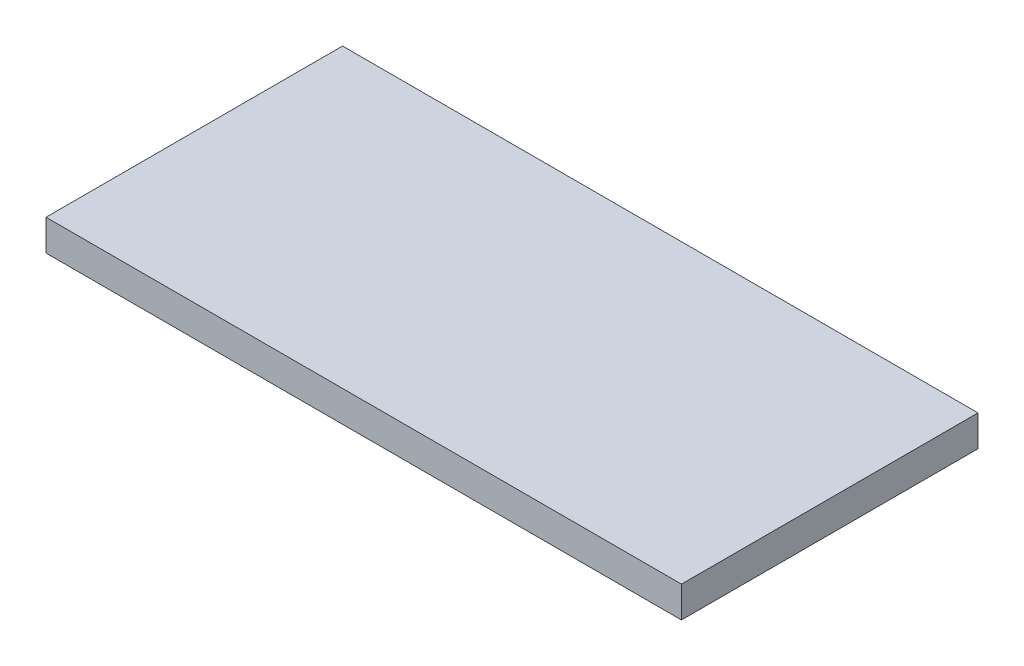
ISO-10303-21;
HEADER;
FILE_DESCRIPTION(('STEP AP214'),'2;1');
FILE_NAME('part.step','',(''),(''),'','','');
FILE_SCHEMA(('AUTOMOTIVE_DESIGN { 1 0 10303 214 1 1 1 1 }'));
ENDSEC;
DATA;
#1=APPLICATION_CONTEXT('core data for automotive mechanical design processes');
#2=APPLICATION_PROTOCOL_DEFINITION('international standard','automotive_design',2000,#1);
#3=PRODUCT_CONTEXT('',#1,'mechanical');
#4=PRODUCT('Part','Part','',(#3));
#5=PRODUCT_RELATED_PRODUCT_CATEGORY('part','',(#4));
#6=PRODUCT_DEFINITION_FORMATION('','',#4);
#7=PRODUCT_DEFINITION_CONTEXT('part definition',#1,'design');
#8=PRODUCT_DEFINITION('design','',#6,#7);
#9=PRODUCT_DEFINITION_SHAPE('','',#8);
#10=(LENGTH_UNIT() NAMED_UNIT(*) SI_UNIT(.MILLI.,.METRE.));
#11=(NAMED_UNIT(*) PLANE_ANGLE_UNIT() SI_UNIT($,.RADIAN.));
#12=(NAMED_UNIT(*) SI_UNIT($,.STERADIAN.) SOLID_ANGLE_UNIT());
#13=UNCERTAINTY_MEASURE_WITH_UNIT(LENGTH_MEASURE(1.E-05),#10,'distance_accuracy_value','');
#14=(GEOMETRIC_REPRESENTATION_CONTEXT(3) GLOBAL_UNCERTAINTY_ASSIGNED_CONTEXT((#13)) GLOBAL_UNIT_ASSIGNED_CONTEXT((#10,
#11,#12)) REPRESENTATION_CONTEXT('',''));
#15=CARTESIAN_POINT('',(0.,0.,0.));
#16=DIRECTION('',(0.,0.,1.));
#17=DIRECTION('',(1.,0.,0.));
#18=AXIS2_PLACEMENT_3D('',#15,#16,#17);
#19=CARTESIAN_POINT('',(22.5,2.2,10.5));
#20=DIRECTION('',(-1.,0.,0.));
#21=DIRECTION('',(0.,0.,1.));
#22=AXIS2_PLACEMENT_3D('',#19,#20,#21);
#23=PLANE('',#22);
#24=DIRECTION('',(0.,0.,-1.));
#25=VECTOR('',#24,1.);
#26=CARTESIAN_POINT('',(22.5,0.,10.5));
#27=LINE('',#26,#25);
#28=CARTESIAN_POINT('',(22.5,0.,10.5));
#29=VERTEX_POINT('',#28);
#30=CARTESIAN_POINT('',(22.5,0.,-10.5));
#31=VERTEX_POINT('',#30);
#32=EDGE_CURVE('E104',#29,#31,#27,.T.);
#33=ORIENTED_EDGE('',*,*,#32,.T.);
#34=DIRECTION('',(0.,-1.,0.));
#35=VECTOR('',#34,1.);
#36=CARTESIAN_POINT('',(22.5,2.2,-10.5));
#37=LINE('',#36,#35);
#38=CARTESIAN_POINT('',(22.5,2.2,-10.5));
#39=VERTEX_POINT('',#38);
#40=EDGE_CURVE('E11',#39,#31,#37,.T.);
#41=ORIENTED_EDGE('',*,*,#40,.F.);
#42=DIRECTION('',(0.,0.,-1.));
#43=VECTOR('',#42,1.);
#44=CARTESIAN_POINT('',(22.5,2.2,10.5));
#45=LINE('',#44,#43);
#46=CARTESIAN_POINT('',(22.5,2.2,10.5));
#47=VERTEX_POINT('',#46);
#48=EDGE_CURVE('E92',#47,#39,#45,.T.);
#49=ORIENTED_EDGE('',*,*,#48,.F.);
#50=DIRECTION('',(0.,-1.,0.));
#51=VECTOR('',#50,1.);
#52=CARTESIAN_POINT('',(22.5,2.2,10.5));
#53=LINE('',#52,#51);
#54=EDGE_CURVE('E100',#47,#29,#53,.T.);
#55=ORIENTED_EDGE('',*,*,#54,.T.);
#56=EDGE_LOOP('',(#33,#41,#49,#55));
#57=FACE_BOUND('',#56,.T.);
#58=ADVANCED_FACE('F41',(#57),#23,.F.);
#59=CARTESIAN_POINT('',(-22.5,2.2,-10.5));
#60=DIRECTION('',(0.,0.,1.));
#61=DIRECTION('',(1.,0.,0.));
#62=AXIS2_PLACEMENT_3D('',#59,#60,#61);
#63=PLANE('',#62);
#64=DIRECTION('',(-1.,0.,0.));
#65=VECTOR('',#64,1.);
#66=CARTESIAN_POINT('',(-22.5,0.,-10.5));
#67=LINE('',#66,#65);
#68=CARTESIAN_POINT('',(-22.5,0.,-10.5));
#69=VERTEX_POINT('',#68);
#70=EDGE_CURVE('E96',#31,#69,#67,.T.);
#71=ORIENTED_EDGE('',*,*,#70,.T.);
#72=DIRECTION('',(0.,-1.,0.));
#73=VECTOR('',#72,1.);
#74=CARTESIAN_POINT('',(-22.5,2.2,-10.5));
#75=LINE('',#74,#73);
#76=CARTESIAN_POINT('',(-22.5,2.2,-10.5));
#77=VERTEX_POINT('',#76);
#78=EDGE_CURVE('E49',#77,#69,#75,.T.);
#79=ORIENTED_EDGE('',*,*,#78,.F.);
#80=DIRECTION('',(-1.,0.,0.));
#81=VECTOR('',#80,1.);
#82=CARTESIAN_POINT('',(-22.5,2.2,-10.5));
#83=LINE('',#82,#81);
#84=EDGE_CURVE('E87',#39,#77,#83,.T.);
#85=ORIENTED_EDGE('',*,*,#84,.F.);
#86=ORIENTED_EDGE('',*,*,#40,.T.);
#87=EDGE_LOOP('',(#71,#79,#85,#86));
#88=FACE_BOUND('',#87,.T.);
#89=ADVANCED_FACE('F95',(#88),#63,.F.);
#90=CARTESIAN_POINT('',(-22.5,2.2,10.5));
#91=DIRECTION('',(1.,0.,0.));
#92=DIRECTION('',(0.,0.,-1.));
#93=AXIS2_PLACEMENT_3D('',#90,#91,#92);
#94=PLANE('',#93);
#95=DIRECTION('',(0.,0.,1.));
#96=VECTOR('',#95,1.);
#97=CARTESIAN_POINT('',(-22.5,0.,10.5));
#98=LINE('',#97,#96);
#99=CARTESIAN_POINT('',(-22.5,0.,10.5));
#100=VERTEX_POINT('',#99);
#101=EDGE_CURVE('E74',#69,#100,#98,.T.);
#102=ORIENTED_EDGE('',*,*,#101,.T.);
#103=DIRECTION('',(0.,-1.,0.));
#104=VECTOR('',#103,1.);
#105=CARTESIAN_POINT('',(-22.5,2.2,10.5));
#106=LINE('',#105,#104);
#107=CARTESIAN_POINT('',(-22.5,2.2,10.5));
#108=VERTEX_POINT('',#107);
#109=EDGE_CURVE('E97',#108,#100,#106,.T.);
#110=ORIENTED_EDGE('',*,*,#109,.F.);
#111=DIRECTION('',(0.,0.,1.));
#112=VECTOR('',#111,1.);
#113=CARTESIAN_POINT('',(-22.5,2.2,10.5));
#114=LINE('',#113,#112);
#115=EDGE_CURVE('E90',#77,#108,#114,.T.);
#116=ORIENTED_EDGE('',*,*,#115,.F.);
#117=ORIENTED_EDGE('',*,*,#78,.T.);
#118=EDGE_LOOP('',(#102,#110,#116,#117));
#119=FACE_BOUND('',#118,.T.);
#120=ADVANCED_FACE('F98',(#119),#94,.F.);
#121=CARTESIAN_POINT('',(-22.5,2.2,10.5));
#122=DIRECTION('',(0.,0.,-1.));
#123=DIRECTION('',(-1.,0.,0.));
#124=AXIS2_PLACEMENT_3D('',#121,#122,#123);
#125=PLANE('',#124);
#126=DIRECTION('',(1.,0.,0.));
#127=VECTOR('',#126,1.);
#128=CARTESIAN_POINT('',(-22.5,0.,10.5));
#129=LINE('',#128,#127);
#130=EDGE_CURVE('E80',#100,#29,#129,.T.);
#131=ORIENTED_EDGE('',*,*,#130,.T.);
#132=ORIENTED_EDGE('',*,*,#54,.F.);
#133=DIRECTION('',(1.,0.,0.));
#134=VECTOR('',#133,1.);
#135=CARTESIAN_POINT('',(-22.5,2.2,10.5));
#136=LINE('',#135,#134);
#137=EDGE_CURVE('E57',#108,#47,#136,.T.);
#138=ORIENTED_EDGE('',*,*,#137,.F.);
#139=ORIENTED_EDGE('',*,*,#109,.T.);
#140=EDGE_LOOP('',(#131,#132,#138,#139));
#141=FACE_BOUND('',#140,.T.);
#142=ADVANCED_FACE('F111',(#141),#125,.F.);
#143=CARTESIAN_POINT('',(0.,2.2,0.));
#144=DIRECTION('',(0.,-1.,0.));
#145=DIRECTION('',(0.,0.,-1.));
#146=AXIS2_PLACEMENT_3D('',#143,#144,#145);
#147=PLANE('',#146);
#148=ORIENTED_EDGE('',*,*,#48,.T.);
#149=ORIENTED_EDGE('',*,*,#84,.T.);
#150=ORIENTED_EDGE('',*,*,#115,.T.);
#151=ORIENTED_EDGE('',*,*,#137,.T.);
#152=EDGE_LOOP('',(#148,#149,#150,#151));
#153=FACE_BOUND('',#152,.T.);
#154=ADVANCED_FACE('F88',(#153),#147,.F.);
#155=CARTESIAN_POINT('',(0.,0.,0.));
#156=DIRECTION('',(0.,-1.,0.));
#157=DIRECTION('',(0.,0.,-1.));
#158=AXIS2_PLACEMENT_3D('',#155,#156,#157);
#159=PLANE('',#158);
#160=ORIENTED_EDGE('',*,*,#32,.F.);
#161=ORIENTED_EDGE('',*,*,#130,.F.);
#162=ORIENTED_EDGE('',*,*,#101,.F.);
#163=ORIENTED_EDGE('',*,*,#70,.F.);
#164=EDGE_LOOP('',(#160,#161,#162,#163));
#165=FACE_BOUND('',#164,.T.);
#166=ADVANCED_FACE('F114',(#165),#159,.T.);
#167=CLOSED_SHELL('',(#58,#89,#120,#142,#154,#166));
#168=MANIFOLD_SOLID_BREP('B2',#167);
#169=ADVANCED_BREP_SHAPE_REPRESENTATION('',(#18,#168),#14);
#170=SHAPE_DEFINITION_REPRESENTATION(#9,#169);
ENDSEC;
END-ISO-10303-21;
